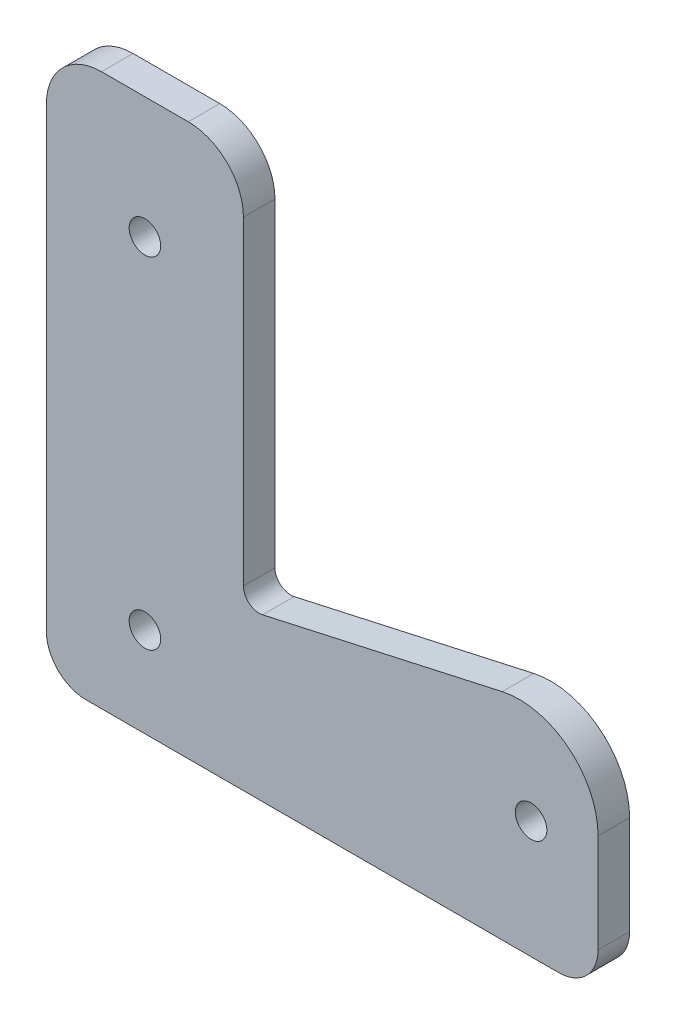
ISO-10303-21;
HEADER;
FILE_DESCRIPTION(('STEP AP214'),'2;1');
FILE_NAME('part.step','',(''),(''),'','','');
FILE_SCHEMA(('AUTOMOTIVE_DESIGN { 1 0 10303 214 1 1 1 1 }'));
ENDSEC;
DATA;
#1=APPLICATION_CONTEXT('core data for automotive mechanical design processes');
#2=APPLICATION_PROTOCOL_DEFINITION('international standard','automotive_design',2000,#1);
#3=PRODUCT_CONTEXT('',#1,'mechanical');
#4=PRODUCT('Part','Part','',(#3));
#5=PRODUCT_RELATED_PRODUCT_CATEGORY('part','',(#4));
#6=PRODUCT_DEFINITION_FORMATION('','',#4);
#7=PRODUCT_DEFINITION_CONTEXT('part definition',#1,'design');
#8=PRODUCT_DEFINITION('design','',#6,#7);
#9=PRODUCT_DEFINITION_SHAPE('','',#8);
#10=(LENGTH_UNIT() NAMED_UNIT(*) SI_UNIT(.MILLI.,.METRE.));
#11=(NAMED_UNIT(*) PLANE_ANGLE_UNIT() SI_UNIT($,.RADIAN.));
#12=(NAMED_UNIT(*) SI_UNIT($,.STERADIAN.) SOLID_ANGLE_UNIT());
#13=UNCERTAINTY_MEASURE_WITH_UNIT(LENGTH_MEASURE(1.E-05),#10,'distance_accuracy_value','');
#14=(GEOMETRIC_REPRESENTATION_CONTEXT(3) GLOBAL_UNCERTAINTY_ASSIGNED_CONTEXT((#13)) GLOBAL_UNIT_ASSIGNED_CONTEXT((#10,
#11,#12)) REPRESENTATION_CONTEXT('',''));
#15=CARTESIAN_POINT('',(0.,0.,0.));
#16=DIRECTION('',(0.,0.,1.));
#17=DIRECTION('',(1.,0.,0.));
#18=AXIS2_PLACEMENT_3D('',#15,#16,#17);
#19=CARTESIAN_POINT('',(0.,0.,4.));
#20=DIRECTION('',(0.,0.,-1.));
#21=DIRECTION('',(-1.,0.,0.));
#22=AXIS2_PLACEMENT_3D('',#19,#20,#21);
#23=PLANE('',#22);
#24=DIRECTION('',(0.,1.,0.));
#25=VECTOR('',#24,1.);
#26=CARTESIAN_POINT('',(70.,30.,4.));
#27=LINE('',#26,#25);
#28=CARTESIAN_POINT('',(69.9999999999999,4.99999999999974,4.));
#29=VERTEX_POINT('',#28);
#30=CARTESIAN_POINT('',(69.9999999999999,17.5338394918967,4.));
#31=VERTEX_POINT('',#30);
#32=EDGE_CURVE('E213',#29,#31,#27,.T.);
#33=ORIENTED_EDGE('',*,*,#32,.T.);
#34=CARTESIAN_POINT('',(59.9999999999999,17.5338394918968,4.));
#35=DIRECTION('',(0.,0.,-1.));
#36=DIRECTION('',(-1.,0.,0.));
#37=AXIS2_PLACEMENT_3D('',#34,#35,#36);
#38=CIRCLE('',#37,10.);
#39=CARTESIAN_POINT('',(57.8306954218134,27.2957100937363,4.));
#40=VERTEX_POINT('',#39);
#41=EDGE_CURVE('E195',#31,#40,#38,.F.);
#42=ORIENTED_EDGE('',*,*,#41,.T.);
#43=DIRECTION('',(-0.976187060183953,-0.216930457818656,0.));
#44=VECTOR('',#43,1.);
#45=CARTESIAN_POINT('',(25.,20.,4.));
#46=LINE('',#45,#44);
#47=CARTESIAN_POINT('',(27.4338609156373,20.5408579812527,4.));
#48=VERTEX_POINT('',#47);
#49=EDGE_CURVE('E210',#40,#48,#46,.T.);
#50=ORIENTED_EDGE('',*,*,#49,.T.);
#51=CARTESIAN_POINT('',(27.,22.4932321016206,4.));
#52=DIRECTION('',(0.,0.,-1.));
#53=DIRECTION('',(-1.,0.,0.));
#54=AXIS2_PLACEMENT_3D('',#51,#52,#53);
#55=CIRCLE('',#54,2.);
#56=CARTESIAN_POINT('',(25.,22.4932321016206,4.));
#57=VERTEX_POINT('',#56);
#58=EDGE_CURVE('E11',#48,#57,#55,.T.);
#59=ORIENTED_EDGE('',*,*,#58,.T.);
#60=DIRECTION('',(0.,1.,0.));
#61=VECTOR('',#60,1.);
#62=CARTESIAN_POINT('',(25.,70.,4.));
#63=LINE('',#62,#61);
#64=CARTESIAN_POINT('',(25.,63.,4.));
#65=VERTEX_POINT('',#64);
#66=EDGE_CURVE('E204',#57,#65,#63,.T.);
#67=ORIENTED_EDGE('',*,*,#66,.T.);
#68=CARTESIAN_POINT('',(18.,63.,4.));
#69=DIRECTION('',(0.,0.,-1.));
#70=DIRECTION('',(-1.,0.,0.));
#71=AXIS2_PLACEMENT_3D('',#68,#69,#70);
#72=CIRCLE('',#71,7.);
#73=CARTESIAN_POINT('',(18.,70.,4.));
#74=VERTEX_POINT('',#73);
#75=EDGE_CURVE('E165',#65,#74,#72,.F.);
#76=ORIENTED_EDGE('',*,*,#75,.T.);
#77=DIRECTION('',(-1.,0.,0.));
#78=VECTOR('',#77,1.);
#79=CARTESIAN_POINT('',(0.,70.,4.));
#80=LINE('',#79,#78);
#81=CARTESIAN_POINT('',(7.,70.,4.));
#82=VERTEX_POINT('',#81);
#83=EDGE_CURVE('E143',#74,#82,#80,.T.);
#84=ORIENTED_EDGE('',*,*,#83,.T.);
#85=CARTESIAN_POINT('',(7.,63.,4.));
#86=DIRECTION('',(0.,0.,-1.));
#87=DIRECTION('',(-1.,0.,0.));
#88=AXIS2_PLACEMENT_3D('',#85,#86,#87);
#89=CIRCLE('',#88,7.);
#90=CARTESIAN_POINT('',(0.,63.,4.));
#91=VERTEX_POINT('',#90);
#92=EDGE_CURVE('E163',#82,#91,#89,.F.);
#93=ORIENTED_EDGE('',*,*,#92,.T.);
#94=DIRECTION('',(0.,-1.,0.));
#95=VECTOR('',#94,1.);
#96=CARTESIAN_POINT('',(0.,0.,4.));
#97=LINE('',#96,#95);
#98=CARTESIAN_POINT('',(0.,4.99999999999998,4.));
#99=VERTEX_POINT('',#98);
#100=EDGE_CURVE('E159',#91,#99,#97,.T.);
#101=ORIENTED_EDGE('',*,*,#100,.T.);
#102=CARTESIAN_POINT('',(5.,4.99999999999998,4.));
#103=DIRECTION('',(0.,0.,-1.));
#104=DIRECTION('',(-1.,0.,0.));
#105=AXIS2_PLACEMENT_3D('',#102,#103,#104);
#106=CIRCLE('',#105,5.);
#107=CARTESIAN_POINT('',(4.99999999999999,0.,4.));
#108=VERTEX_POINT('',#107);
#109=EDGE_CURVE('E182',#99,#108,#106,.F.);
#110=ORIENTED_EDGE('',*,*,#109,.T.);
#111=DIRECTION('',(1.,0.,0.));
#112=VECTOR('',#111,1.);
#113=CARTESIAN_POINT('',(69.9999999999998,-2.52718113472048E-13,4.));
#114=LINE('',#113,#112);
#115=CARTESIAN_POINT('',(64.9999999999998,-2.34666819652616E-13,4.));
#116=VERTEX_POINT('',#115);
#117=EDGE_CURVE('E153',#108,#116,#114,.T.);
#118=ORIENTED_EDGE('',*,*,#117,.T.);
#119=CARTESIAN_POINT('',(64.9999999999999,4.99999999999976,4.));
#120=DIRECTION('',(0.,0.,-1.));
#121=DIRECTION('',(-1.,0.,0.));
#122=AXIS2_PLACEMENT_3D('',#119,#120,#121);
#123=CIRCLE('',#122,5.);
#124=EDGE_CURVE('E184',#116,#29,#123,.F.);
#125=ORIENTED_EDGE('',*,*,#124,.T.);
#126=EDGE_LOOP('',(#33,#42,#50,#59,#67,#76,#84,#93,#101,#110,#118,#125));
#127=FACE_BOUND('',#126,.T.);
#128=CARTESIAN_POINT('',(61.5,14.9,4.));
#129=DIRECTION('',(0.,0.,1.));
#130=DIRECTION('',(1.,0.,0.));
#131=AXIS2_PLACEMENT_3D('',#128,#129,#130);
#132=CIRCLE('',#131,2.);
#133=CARTESIAN_POINT('',(63.5,14.9,4.));
#134=VERTEX_POINT('',#133);
#135=EDGE_CURVE('E226',#134,#134,#132,.T.);
#136=ORIENTED_EDGE('',*,*,#135,.F.);
#137=EDGE_LOOP('',(#136));
#138=FACE_BOUND('',#137,.T.);
#139=CARTESIAN_POINT('',(12.5,11.4,4.));
#140=DIRECTION('',(0.,0.,1.));
#141=DIRECTION('',(1.,0.,0.));
#142=AXIS2_PLACEMENT_3D('',#139,#140,#141);
#143=CIRCLE('',#142,2.);
#144=CARTESIAN_POINT('',(14.5,11.4,4.));
#145=VERTEX_POINT('',#144);
#146=EDGE_CURVE('E294',#145,#145,#143,.T.);
#147=ORIENTED_EDGE('',*,*,#146,.F.);
#148=EDGE_LOOP('',(#147));
#149=FACE_BOUND('',#148,.T.);
#150=CARTESIAN_POINT('',(12.5,54.6,4.));
#151=DIRECTION('',(0.,0.,1.));
#152=DIRECTION('',(1.,0.,0.));
#153=AXIS2_PLACEMENT_3D('',#150,#151,#152);
#154=CIRCLE('',#153,2.);
#155=CARTESIAN_POINT('',(14.5,54.6,4.));
#156=VERTEX_POINT('',#155);
#157=EDGE_CURVE('E300',#156,#156,#154,.T.);
#158=ORIENTED_EDGE('',*,*,#157,.F.);
#159=EDGE_LOOP('',(#158));
#160=FACE_BOUND('',#159,.T.);
#161=ADVANCED_FACE('F36',(#127,#138,#149,#160),#23,.F.);
#162=CARTESIAN_POINT('',(0.,0.,0.));
#163=DIRECTION('',(0.,0.,-1.));
#164=DIRECTION('',(-1.,0.,0.));
#165=AXIS2_PLACEMENT_3D('',#162,#163,#164);
#166=PLANE('',#165);
#167=CARTESIAN_POINT('',(12.5,11.4,0.));
#168=DIRECTION('',(0.,0.,1.));
#169=DIRECTION('',(1.,0.,0.));
#170=AXIS2_PLACEMENT_3D('',#167,#168,#169);
#171=CIRCLE('',#170,2.);
#172=CARTESIAN_POINT('',(14.5,11.4,0.));
#173=VERTEX_POINT('',#172);
#174=EDGE_CURVE('E297',#173,#173,#171,.T.);
#175=ORIENTED_EDGE('',*,*,#174,.T.);
#176=EDGE_LOOP('',(#175));
#177=FACE_BOUND('',#176,.T.);
#178=DIRECTION('',(-0.976187060183953,-0.216930457818656,0.));
#179=VECTOR('',#178,1.);
#180=CARTESIAN_POINT('',(25.,20.,0.));
#181=LINE('',#180,#179);
#182=CARTESIAN_POINT('',(57.8306954218134,27.2957100937363,0.));
#183=VERTEX_POINT('',#182);
#184=CARTESIAN_POINT('',(27.4338609156373,20.5408579812527,0.));
#185=VERTEX_POINT('',#184);
#186=EDGE_CURVE('E155',#183,#185,#181,.T.);
#187=ORIENTED_EDGE('',*,*,#186,.F.);
#188=CARTESIAN_POINT('',(59.9999999999999,17.5338394918968,0.));
#189=DIRECTION('',(0.,0.,-1.));
#190=DIRECTION('',(-1.,0.,0.));
#191=AXIS2_PLACEMENT_3D('',#188,#189,#190);
#192=CIRCLE('',#191,10.);
#193=CARTESIAN_POINT('',(69.9999999999999,17.5338394918967,0.));
#194=VERTEX_POINT('',#193);
#195=EDGE_CURVE('E191',#183,#194,#192,.T.);
#196=ORIENTED_EDGE('',*,*,#195,.T.);
#197=DIRECTION('',(0.,1.,0.));
#198=VECTOR('',#197,1.);
#199=CARTESIAN_POINT('',(70.,30.,0.));
#200=LINE('',#199,#198);
#201=CARTESIAN_POINT('',(69.9999999999999,4.99999999999974,0.));
#202=VERTEX_POINT('',#201);
#203=EDGE_CURVE('E225',#202,#194,#200,.T.);
#204=ORIENTED_EDGE('',*,*,#203,.F.);
#205=CARTESIAN_POINT('',(64.9999999999999,4.99999999999976,0.));
#206=DIRECTION('',(0.,0.,-1.));
#207=DIRECTION('',(-1.,0.,0.));
#208=AXIS2_PLACEMENT_3D('',#205,#206,#207);
#209=CIRCLE('',#208,5.);
#210=CARTESIAN_POINT('',(64.9999999999998,-2.34666819652616E-13,0.));
#211=VERTEX_POINT('',#210);
#212=EDGE_CURVE('E175',#202,#211,#209,.T.);
#213=ORIENTED_EDGE('',*,*,#212,.T.);
#214=DIRECTION('',(1.,0.,0.));
#215=VECTOR('',#214,1.);
#216=CARTESIAN_POINT('',(69.9999999999998,-2.52718113472048E-13,0.));
#217=LINE('',#216,#215);
#218=CARTESIAN_POINT('',(4.99999999999999,0.,0.));
#219=VERTEX_POINT('',#218);
#220=EDGE_CURVE('E222',#219,#211,#217,.T.);
#221=ORIENTED_EDGE('',*,*,#220,.F.);
#222=CARTESIAN_POINT('',(5.,4.99999999999998,0.));
#223=DIRECTION('',(0.,0.,-1.));
#224=DIRECTION('',(-1.,0.,0.));
#225=AXIS2_PLACEMENT_3D('',#222,#223,#224);
#226=CIRCLE('',#225,5.);
#227=CARTESIAN_POINT('',(0.,4.99999999999998,0.));
#228=VERTEX_POINT('',#227);
#229=EDGE_CURVE('E173',#219,#228,#226,.T.);
#230=ORIENTED_EDGE('',*,*,#229,.T.);
#231=DIRECTION('',(0.,-1.,0.));
#232=VECTOR('',#231,1.);
#233=CARTESIAN_POINT('',(0.,0.,0.));
#234=LINE('',#233,#232);
#235=CARTESIAN_POINT('',(0.,63.,0.));
#236=VERTEX_POINT('',#235);
#237=EDGE_CURVE('E149',#236,#228,#234,.T.);
#238=ORIENTED_EDGE('',*,*,#237,.F.);
#239=CARTESIAN_POINT('',(7.,63.,0.));
#240=DIRECTION('',(0.,0.,-1.));
#241=DIRECTION('',(-1.,0.,0.));
#242=AXIS2_PLACEMENT_3D('',#239,#240,#241);
#243=CIRCLE('',#242,7.);
#244=CARTESIAN_POINT('',(7.,70.,0.));
#245=VERTEX_POINT('',#244);
#246=EDGE_CURVE('E134',#236,#245,#243,.T.);
#247=ORIENTED_EDGE('',*,*,#246,.T.);
#248=DIRECTION('',(-1.,0.,0.));
#249=VECTOR('',#248,1.);
#250=CARTESIAN_POINT('',(0.,70.,0.));
#251=LINE('',#250,#249);
#252=CARTESIAN_POINT('',(18.,70.,0.));
#253=VERTEX_POINT('',#252);
#254=EDGE_CURVE('E140',#253,#245,#251,.T.);
#255=ORIENTED_EDGE('',*,*,#254,.F.);
#256=CARTESIAN_POINT('',(18.,63.,0.));
#257=DIRECTION('',(0.,0.,-1.));
#258=DIRECTION('',(-1.,0.,0.));
#259=AXIS2_PLACEMENT_3D('',#256,#257,#258);
#260=CIRCLE('',#259,7.);
#261=CARTESIAN_POINT('',(25.,63.,0.));
#262=VERTEX_POINT('',#261);
#263=EDGE_CURVE('E126',#253,#262,#260,.T.);
#264=ORIENTED_EDGE('',*,*,#263,.T.);
#265=DIRECTION('',(0.,1.,0.));
#266=VECTOR('',#265,1.);
#267=CARTESIAN_POINT('',(25.,70.,0.));
#268=LINE('',#267,#266);
#269=CARTESIAN_POINT('',(25.,22.4932321016206,0.));
#270=VERTEX_POINT('',#269);
#271=EDGE_CURVE('E150',#270,#262,#268,.T.);
#272=ORIENTED_EDGE('',*,*,#271,.F.);
#273=CARTESIAN_POINT('',(27.,22.4932321016206,0.));
#274=DIRECTION('',(0.,0.,-1.));
#275=DIRECTION('',(-1.,0.,0.));
#276=AXIS2_PLACEMENT_3D('',#273,#274,#275);
#277=CIRCLE('',#276,2.);
#278=EDGE_CURVE('E44',#270,#185,#277,.F.);
#279=ORIENTED_EDGE('',*,*,#278,.T.);
#280=EDGE_LOOP('',(#187,#196,#204,#213,#221,#230,#238,#247,#255,#264,#272,#279));
#281=FACE_BOUND('',#280,.T.);
#282=CARTESIAN_POINT('',(61.5,14.9,0.));
#283=DIRECTION('',(0.,0.,1.));
#284=DIRECTION('',(1.,0.,0.));
#285=AXIS2_PLACEMENT_3D('',#282,#283,#284);
#286=CIRCLE('',#285,2.);
#287=CARTESIAN_POINT('',(63.5,14.9,0.));
#288=VERTEX_POINT('',#287);
#289=EDGE_CURVE('E291',#288,#288,#286,.T.);
#290=ORIENTED_EDGE('',*,*,#289,.T.);
#291=EDGE_LOOP('',(#290));
#292=FACE_BOUND('',#291,.T.);
#293=CARTESIAN_POINT('',(12.5,54.6,0.));
#294=DIRECTION('',(0.,0.,1.));
#295=DIRECTION('',(1.,0.,0.));
#296=AXIS2_PLACEMENT_3D('',#293,#294,#295);
#297=CIRCLE('',#296,2.);
#298=CARTESIAN_POINT('',(14.5,54.6,0.));
#299=VERTEX_POINT('',#298);
#300=EDGE_CURVE('E303',#299,#299,#297,.T.);
#301=ORIENTED_EDGE('',*,*,#300,.T.);
#302=EDGE_LOOP('',(#301));
#303=FACE_BOUND('',#302,.T.);
#304=ADVANCED_FACE('F146',(#177,#281,#292,#303),#166,.T.);
#305=CARTESIAN_POINT('',(69.9999999999998,-2.52718113472048E-13,4.));
#306=DIRECTION('',(0.,1.,0.));
#307=DIRECTION('',(-1.,0.,0.));
#308=AXIS2_PLACEMENT_3D('',#305,#306,#307);
#309=PLANE('',#308);
#310=ORIENTED_EDGE('',*,*,#220,.T.);
#311=DIRECTION('',(0.,0.,-1.));
#312=VECTOR('',#311,1.);
#313=CARTESIAN_POINT('',(64.9999999999998,-2.34666819652616E-13,4.));
#314=LINE('',#313,#312);
#315=EDGE_CURVE('E180',#211,#116,#314,.F.);
#316=ORIENTED_EDGE('',*,*,#315,.T.);
#317=ORIENTED_EDGE('',*,*,#117,.F.);
#318=DIRECTION('',(0.,0.,-1.));
#319=VECTOR('',#318,1.);
#320=CARTESIAN_POINT('',(4.99999999999999,0.,4.));
#321=LINE('',#320,#319);
#322=EDGE_CURVE('E177',#108,#219,#321,.T.);
#323=ORIENTED_EDGE('',*,*,#322,.T.);
#324=EDGE_LOOP('',(#310,#316,#317,#323));
#325=FACE_BOUND('',#324,.T.);
#326=ADVANCED_FACE('F251',(#325),#309,.F.);
#327=CARTESIAN_POINT('',(70.,30.,4.));
#328=DIRECTION('',(-1.,0.,0.));
#329=DIRECTION('',(0.,-1.,0.));
#330=AXIS2_PLACEMENT_3D('',#327,#328,#329);
#331=PLANE('',#330);
#332=ORIENTED_EDGE('',*,*,#203,.T.);
#333=DIRECTION('',(0.,0.,-1.));
#334=VECTOR('',#333,1.);
#335=CARTESIAN_POINT('',(69.9999999999999,17.5338394918967,4.));
#336=LINE('',#335,#334);
#337=EDGE_CURVE('E193',#194,#31,#336,.F.);
#338=ORIENTED_EDGE('',*,*,#337,.T.);
#339=ORIENTED_EDGE('',*,*,#32,.F.);
#340=DIRECTION('',(0.,0.,-1.));
#341=VECTOR('',#340,1.);
#342=CARTESIAN_POINT('',(69.9999999999999,4.99999999999974,4.));
#343=LINE('',#342,#341);
#344=EDGE_CURVE('E170',#29,#202,#343,.T.);
#345=ORIENTED_EDGE('',*,*,#344,.T.);
#346=EDGE_LOOP('',(#332,#338,#339,#345));
#347=FACE_BOUND('',#346,.T.);
#348=ADVANCED_FACE('F233',(#347),#331,.F.);
#349=CARTESIAN_POINT('',(25.,20.,4.));
#350=DIRECTION('',(0.216930457818656,-0.976187060183953,0.));
#351=DIRECTION('',(0.976187060183953,0.216930457818656,0.));
#352=AXIS2_PLACEMENT_3D('',#349,#350,#351);
#353=PLANE('',#352);
#354=ORIENTED_EDGE('',*,*,#186,.T.);
#355=DIRECTION('',(0.,0.,-1.));
#356=VECTOR('',#355,1.);
#357=CARTESIAN_POINT('',(27.4338609156373,20.5408579812527,4.));
#358=LINE('',#357,#356);
#359=EDGE_CURVE('E57',#185,#48,#358,.F.);
#360=ORIENTED_EDGE('',*,*,#359,.T.);
#361=ORIENTED_EDGE('',*,*,#49,.F.);
#362=DIRECTION('',(0.,0.,-1.));
#363=VECTOR('',#362,1.);
#364=CARTESIAN_POINT('',(57.8306954218134,27.2957100937363,4.));
#365=LINE('',#364,#363);
#366=EDGE_CURVE('E188',#40,#183,#365,.T.);
#367=ORIENTED_EDGE('',*,*,#366,.T.);
#368=EDGE_LOOP('',(#354,#360,#361,#367));
#369=FACE_BOUND('',#368,.T.);
#370=ADVANCED_FACE('F228',(#369),#353,.F.);
#371=CARTESIAN_POINT('',(25.,70.,4.));
#372=DIRECTION('',(-1.,0.,0.));
#373=DIRECTION('',(0.,-1.,0.));
#374=AXIS2_PLACEMENT_3D('',#371,#372,#373);
#375=PLANE('',#374);
#376=ORIENTED_EDGE('',*,*,#66,.F.);
#377=DIRECTION('',(0.,0.,-1.));
#378=VECTOR('',#377,1.);
#379=CARTESIAN_POINT('',(25.,22.4932321016206,0.));
#380=LINE('',#379,#378);
#381=EDGE_CURVE('E197',#57,#270,#380,.T.);
#382=ORIENTED_EDGE('',*,*,#381,.T.);
#383=ORIENTED_EDGE('',*,*,#271,.T.);
#384=DIRECTION('',(0.,0.,-1.));
#385=VECTOR('',#384,1.);
#386=CARTESIAN_POINT('',(25.,63.,4.));
#387=LINE('',#386,#385);
#388=EDGE_CURVE('E132',#262,#65,#387,.F.);
#389=ORIENTED_EDGE('',*,*,#388,.T.);
#390=EDGE_LOOP('',(#376,#382,#383,#389));
#391=FACE_BOUND('',#390,.T.);
#392=ADVANCED_FACE('F203',(#391),#375,.F.);
#393=CARTESIAN_POINT('',(0.,70.,4.));
#394=DIRECTION('',(0.,-1.,0.));
#395=DIRECTION('',(0.,0.,-1.));
#396=AXIS2_PLACEMENT_3D('',#393,#394,#395);
#397=PLANE('',#396);
#398=ORIENTED_EDGE('',*,*,#83,.F.);
#399=DIRECTION('',(0.,0.,-1.));
#400=VECTOR('',#399,1.);
#401=CARTESIAN_POINT('',(18.,70.,4.));
#402=LINE('',#401,#400);
#403=EDGE_CURVE('E130',#74,#253,#402,.T.);
#404=ORIENTED_EDGE('',*,*,#403,.T.);
#405=ORIENTED_EDGE('',*,*,#254,.T.);
#406=DIRECTION('',(0.,0.,-1.));
#407=VECTOR('',#406,1.);
#408=CARTESIAN_POINT('',(7.,70.,4.));
#409=LINE('',#408,#407);
#410=EDGE_CURVE('E144',#245,#82,#409,.F.);
#411=ORIENTED_EDGE('',*,*,#410,.T.);
#412=EDGE_LOOP('',(#398,#404,#405,#411));
#413=FACE_BOUND('',#412,.T.);
#414=ADVANCED_FACE('F139',(#413),#397,.F.);
#415=CARTESIAN_POINT('',(0.,0.,4.));
#416=DIRECTION('',(1.,0.,0.));
#417=DIRECTION('',(0.,0.,-1.));
#418=AXIS2_PLACEMENT_3D('',#415,#416,#417);
#419=PLANE('',#418);
#420=ORIENTED_EDGE('',*,*,#237,.T.);
#421=DIRECTION('',(0.,0.,-1.));
#422=VECTOR('',#421,1.);
#423=CARTESIAN_POINT('',(0.,4.99999999999998,4.));
#424=LINE('',#423,#422);
#425=EDGE_CURVE('E186',#228,#99,#424,.F.);
#426=ORIENTED_EDGE('',*,*,#425,.T.);
#427=ORIENTED_EDGE('',*,*,#100,.F.);
#428=DIRECTION('',(0.,0.,-1.));
#429=VECTOR('',#428,1.);
#430=CARTESIAN_POINT('',(0.,63.,4.));
#431=LINE('',#430,#429);
#432=EDGE_CURVE('E167',#91,#236,#431,.T.);
#433=ORIENTED_EDGE('',*,*,#432,.T.);
#434=EDGE_LOOP('',(#420,#426,#427,#433));
#435=FACE_BOUND('',#434,.T.);
#436=ADVANCED_FACE('F258',(#435),#419,.F.);
#437=CARTESIAN_POINT('',(61.5,14.9,4.));
#438=DIRECTION('',(0.,0.,-1.));
#439=DIRECTION('',(-1.,0.,0.));
#440=AXIS2_PLACEMENT_3D('',#437,#438,#439);
#441=CYLINDRICAL_SURFACE('',#440,2.);
#442=ORIENTED_EDGE('',*,*,#135,.T.);
#443=EDGE_LOOP('',(#442));
#444=FACE_BOUND('',#443,.T.);
#445=ORIENTED_EDGE('',*,*,#289,.F.);
#446=EDGE_LOOP('',(#445));
#447=FACE_BOUND('',#446,.T.);
#448=ADVANCED_FACE('F255',(#444,#447),#441,.F.);
#449=CARTESIAN_POINT('',(12.5,11.4,4.));
#450=DIRECTION('',(0.,0.,-1.));
#451=DIRECTION('',(-1.,0.,0.));
#452=AXIS2_PLACEMENT_3D('',#449,#450,#451);
#453=CYLINDRICAL_SURFACE('',#452,2.);
#454=ORIENTED_EDGE('',*,*,#146,.T.);
#455=EDGE_LOOP('',(#454));
#456=FACE_BOUND('',#455,.T.);
#457=ORIENTED_EDGE('',*,*,#174,.F.);
#458=EDGE_LOOP('',(#457));
#459=FACE_BOUND('',#458,.T.);
#460=ADVANCED_FACE('F312',(#456,#459),#453,.F.);
#461=CARTESIAN_POINT('',(12.5,54.6,4.));
#462=DIRECTION('',(0.,0.,-1.));
#463=DIRECTION('',(-1.,0.,0.));
#464=AXIS2_PLACEMENT_3D('',#461,#462,#463);
#465=CYLINDRICAL_SURFACE('',#464,2.);
#466=ORIENTED_EDGE('',*,*,#157,.T.);
#467=EDGE_LOOP('',(#466));
#468=FACE_BOUND('',#467,.T.);
#469=ORIENTED_EDGE('',*,*,#300,.F.);
#470=EDGE_LOOP('',(#469));
#471=FACE_BOUND('',#470,.T.);
#472=ADVANCED_FACE('F276',(#468,#471),#465,.F.);
#473=CARTESIAN_POINT('',(18.,63.,4.));
#474=DIRECTION('',(0.,0.,-1.));
#475=DIRECTION('',(-1.,0.,0.));
#476=AXIS2_PLACEMENT_3D('',#473,#474,#475);
#477=CYLINDRICAL_SURFACE('',#476,7.);
#478=ORIENTED_EDGE('',*,*,#75,.F.);
#479=ORIENTED_EDGE('',*,*,#388,.F.);
#480=ORIENTED_EDGE('',*,*,#263,.F.);
#481=ORIENTED_EDGE('',*,*,#403,.F.);
#482=EDGE_LOOP('',(#478,#479,#480,#481));
#483=FACE_BOUND('',#482,.T.);
#484=ADVANCED_FACE('F129',(#483),#477,.T.);
#485=CARTESIAN_POINT('',(7.,63.,4.));
#486=DIRECTION('',(0.,0.,-1.));
#487=DIRECTION('',(-1.,0.,0.));
#488=AXIS2_PLACEMENT_3D('',#485,#486,#487);
#489=CYLINDRICAL_SURFACE('',#488,7.);
#490=ORIENTED_EDGE('',*,*,#92,.F.);
#491=ORIENTED_EDGE('',*,*,#410,.F.);
#492=ORIENTED_EDGE('',*,*,#246,.F.);
#493=ORIENTED_EDGE('',*,*,#432,.F.);
#494=EDGE_LOOP('',(#490,#491,#492,#493));
#495=FACE_BOUND('',#494,.T.);
#496=ADVANCED_FACE('F275',(#495),#489,.T.);
#497=CARTESIAN_POINT('',(64.9999999999999,4.99999999999976,4.));
#498=DIRECTION('',(0.,0.,-1.));
#499=DIRECTION('',(-1.,0.,0.));
#500=AXIS2_PLACEMENT_3D('',#497,#498,#499);
#501=CYLINDRICAL_SURFACE('',#500,5.);
#502=ORIENTED_EDGE('',*,*,#124,.F.);
#503=ORIENTED_EDGE('',*,*,#315,.F.);
#504=ORIENTED_EDGE('',*,*,#212,.F.);
#505=ORIENTED_EDGE('',*,*,#344,.F.);
#506=EDGE_LOOP('',(#502,#503,#504,#505));
#507=FACE_BOUND('',#506,.T.);
#508=ADVANCED_FACE('F243',(#507),#501,.T.);
#509=CARTESIAN_POINT('',(5.,4.99999999999998,4.));
#510=DIRECTION('',(0.,0.,-1.));
#511=DIRECTION('',(-1.,0.,0.));
#512=AXIS2_PLACEMENT_3D('',#509,#510,#511);
#513=CYLINDRICAL_SURFACE('',#512,5.);
#514=ORIENTED_EDGE('',*,*,#109,.F.);
#515=ORIENTED_EDGE('',*,*,#425,.F.);
#516=ORIENTED_EDGE('',*,*,#229,.F.);
#517=ORIENTED_EDGE('',*,*,#322,.F.);
#518=EDGE_LOOP('',(#514,#515,#516,#517));
#519=FACE_BOUND('',#518,.T.);
#520=ADVANCED_FACE('F238',(#519),#513,.T.);
#521=CARTESIAN_POINT('',(59.9999999999999,17.5338394918968,4.));
#522=DIRECTION('',(0.,0.,-1.));
#523=DIRECTION('',(-1.,0.,0.));
#524=AXIS2_PLACEMENT_3D('',#521,#522,#523);
#525=CYLINDRICAL_SURFACE('',#524,10.);
#526=ORIENTED_EDGE('',*,*,#41,.F.);
#527=ORIENTED_EDGE('',*,*,#337,.F.);
#528=ORIENTED_EDGE('',*,*,#195,.F.);
#529=ORIENTED_EDGE('',*,*,#366,.F.);
#530=EDGE_LOOP('',(#526,#527,#528,#529));
#531=FACE_BOUND('',#530,.T.);
#532=ADVANCED_FACE('F236',(#531),#525,.T.);
#533=CARTESIAN_POINT('',(27.,22.4932321016206,4.));
#534=DIRECTION('',(0.,0.,1.));
#535=DIRECTION('',(1.,0.,0.));
#536=AXIS2_PLACEMENT_3D('',#533,#534,#535);
#537=CYLINDRICAL_SURFACE('',#536,2.);
#538=ORIENTED_EDGE('',*,*,#58,.F.);
#539=ORIENTED_EDGE('',*,*,#359,.F.);
#540=ORIENTED_EDGE('',*,*,#278,.F.);
#541=ORIENTED_EDGE('',*,*,#381,.F.);
#542=EDGE_LOOP('',(#538,#539,#540,#541));
#543=FACE_BOUND('',#542,.T.);
#544=ADVANCED_FACE('F38',(#543),#537,.F.);
#545=CLOSED_SHELL('',(#161,#304,#326,#348,#370,#392,#414,#436,#448,#460,#472,#484,#496,#508,
#520,#532,#544));
#546=MANIFOLD_SOLID_BREP('B2',#545);
#547=ADVANCED_BREP_SHAPE_REPRESENTATION('',(#18,#546),#14);
#548=SHAPE_DEFINITION_REPRESENTATION(#9,#547);
ENDSEC;
END-ISO-10303-21;
